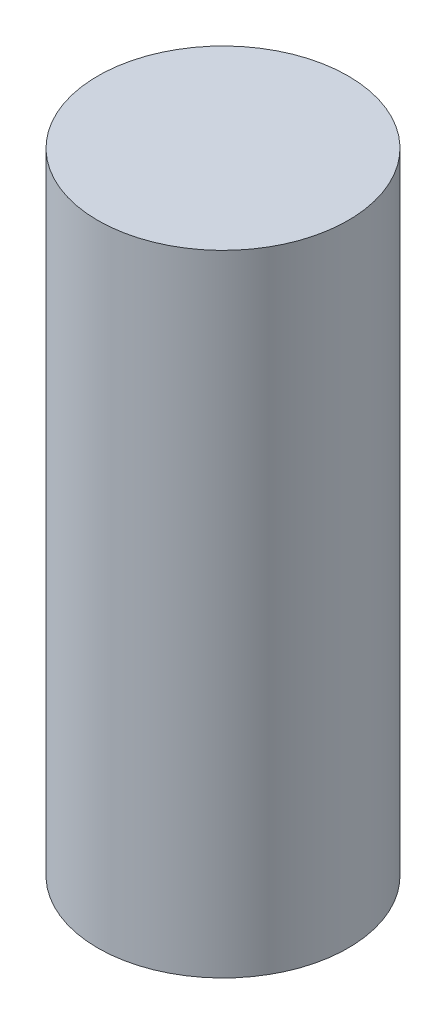
ISO-10303-21;
HEADER;
FILE_DESCRIPTION(('STEP AP214'),'2;1');
FILE_NAME('part.step','',(''),(''),'','','');
FILE_SCHEMA(('AUTOMOTIVE_DESIGN { 1 0 10303 214 1 1 1 1 }'));
ENDSEC;
DATA;
#1=APPLICATION_CONTEXT('core data for automotive mechanical design processes');
#2=APPLICATION_PROTOCOL_DEFINITION('international standard','automotive_design',2000,#1);
#3=PRODUCT_CONTEXT('',#1,'mechanical');
#4=PRODUCT('Part','Part','',(#3));
#5=PRODUCT_RELATED_PRODUCT_CATEGORY('part','',(#4));
#6=PRODUCT_DEFINITION_FORMATION('','',#4);
#7=PRODUCT_DEFINITION_CONTEXT('part definition',#1,'design');
#8=PRODUCT_DEFINITION('design','',#6,#7);
#9=PRODUCT_DEFINITION_SHAPE('','',#8);
#10=(LENGTH_UNIT() NAMED_UNIT(*) SI_UNIT(.MILLI.,.METRE.));
#11=(NAMED_UNIT(*) PLANE_ANGLE_UNIT() SI_UNIT($,.RADIAN.));
#12=(NAMED_UNIT(*) SI_UNIT($,.STERADIAN.) SOLID_ANGLE_UNIT());
#13=UNCERTAINTY_MEASURE_WITH_UNIT(LENGTH_MEASURE(1.E-05),#10,'distance_accuracy_value','');
#14=(GEOMETRIC_REPRESENTATION_CONTEXT(3) GLOBAL_UNCERTAINTY_ASSIGNED_CONTEXT((#13)) GLOBAL_UNIT_ASSIGNED_CONTEXT((#10,
#11,#12)) REPRESENTATION_CONTEXT('',''));
#15=CARTESIAN_POINT('',(0.,0.,0.));
#16=DIRECTION('',(0.,0.,1.));
#17=DIRECTION('',(1.,0.,0.));
#18=AXIS2_PLACEMENT_3D('',#15,#16,#17);
#19=CARTESIAN_POINT('',(0.,11.2,0.));
#20=DIRECTION('',(0.,-1.,0.));
#21=DIRECTION('',(0.,0.,-1.));
#22=AXIS2_PLACEMENT_3D('',#19,#20,#21);
#23=CYLINDRICAL_SURFACE('',#22,2.225);
#24=CARTESIAN_POINT('',(0.,11.2,0.));
#25=DIRECTION('',(0.,1.,0.));
#26=DIRECTION('',(0.,0.,1.));
#27=AXIS2_PLACEMENT_3D('',#24,#25,#26);
#28=CIRCLE('',#27,2.225);
#29=CARTESIAN_POINT('',(0.,11.2,2.225));
#30=VERTEX_POINT('',#29);
#31=EDGE_CURVE('E10',#30,#30,#28,.T.);
#32=ORIENTED_EDGE('',*,*,#31,.F.);
#33=EDGE_LOOP('',(#32));
#34=FACE_BOUND('',#33,.T.);
#35=CARTESIAN_POINT('',(0.,0.,0.));
#36=DIRECTION('',(0.,1.,0.));
#37=DIRECTION('',(0.,0.,1.));
#38=AXIS2_PLACEMENT_3D('',#35,#36,#37);
#39=CIRCLE('',#38,2.225);
#40=CARTESIAN_POINT('',(0.,0.,2.225));
#41=VERTEX_POINT('',#40);
#42=EDGE_CURVE('E42',#41,#41,#39,.T.);
#43=ORIENTED_EDGE('',*,*,#42,.T.);
#44=EDGE_LOOP('',(#43));
#45=FACE_BOUND('',#44,.T.);
#46=ADVANCED_FACE('F39',(#34,#45),#23,.T.);
#47=CARTESIAN_POINT('',(0.,11.2,0.));
#48=DIRECTION('',(0.,1.,0.));
#49=DIRECTION('',(0.,0.,1.));
#50=AXIS2_PLACEMENT_3D('',#47,#48,#49);
#51=PLANE('',#50);
#52=ORIENTED_EDGE('',*,*,#31,.T.);
#53=EDGE_LOOP('',(#52));
#54=FACE_BOUND('',#53,.T.);
#55=ADVANCED_FACE('F56',(#54),#51,.T.);
#56=CARTESIAN_POINT('',(0.,0.,0.));
#57=DIRECTION('',(0.,1.,0.));
#58=DIRECTION('',(0.,0.,1.));
#59=AXIS2_PLACEMENT_3D('',#56,#57,#58);
#60=PLANE('',#59);
#61=ORIENTED_EDGE('',*,*,#42,.F.);
#62=EDGE_LOOP('',(#61));
#63=FACE_BOUND('',#62,.T.);
#64=ADVANCED_FACE('F54',(#63),#60,.F.);
#65=CLOSED_SHELL('',(#46,#55,#64));
#66=MANIFOLD_SOLID_BREP('B2',#65);
#67=ADVANCED_BREP_SHAPE_REPRESENTATION('',(#18,#66),#14);
#68=SHAPE_DEFINITION_REPRESENTATION(#9,#67);
ENDSEC;
END-ISO-10303-21;
